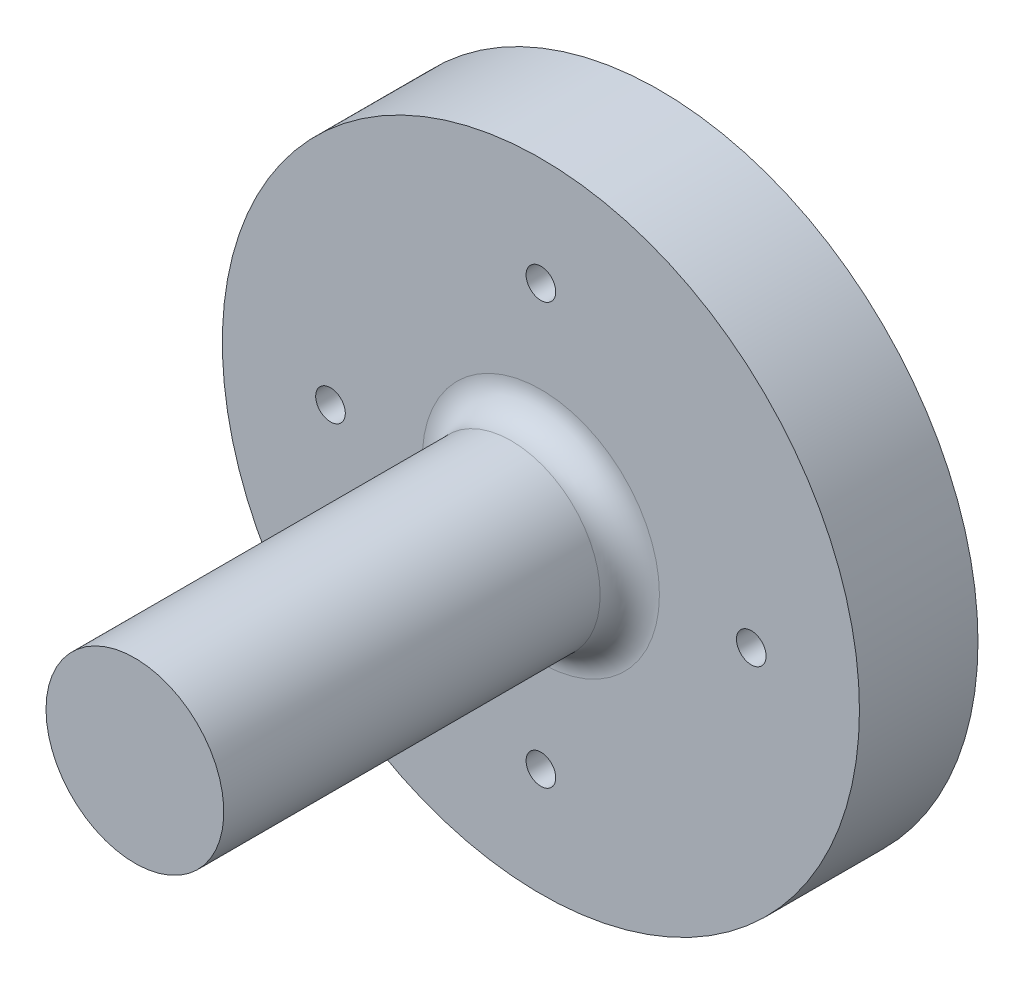
ISO-10303-21;
HEADER;
FILE_DESCRIPTION(('STEP AP214'),'2;1');
FILE_NAME('part.step','',(''),(''),'','','');
FILE_SCHEMA(('AUTOMOTIVE_DESIGN { 1 0 10303 214 1 1 1 1 }'));
ENDSEC;
DATA;
#1=APPLICATION_CONTEXT('core data for automotive mechanical design processes');
#2=APPLICATION_PROTOCOL_DEFINITION('international standard','automotive_design',2000,#1);
#3=PRODUCT_CONTEXT('',#1,'mechanical');
#4=PRODUCT('Part','Part','',(#3));
#5=PRODUCT_RELATED_PRODUCT_CATEGORY('part','',(#4));
#6=PRODUCT_DEFINITION_FORMATION('','',#4);
#7=PRODUCT_DEFINITION_CONTEXT('part definition',#1,'design');
#8=PRODUCT_DEFINITION('design','',#6,#7);
#9=PRODUCT_DEFINITION_SHAPE('','',#8);
#10=(LENGTH_UNIT() NAMED_UNIT(*) SI_UNIT(.MILLI.,.METRE.));
#11=(NAMED_UNIT(*) PLANE_ANGLE_UNIT() SI_UNIT($,.RADIAN.));
#12=(NAMED_UNIT(*) SI_UNIT($,.STERADIAN.) SOLID_ANGLE_UNIT());
#13=UNCERTAINTY_MEASURE_WITH_UNIT(LENGTH_MEASURE(1.E-05),#10,'distance_accuracy_value','');
#14=(GEOMETRIC_REPRESENTATION_CONTEXT(3) GLOBAL_UNCERTAINTY_ASSIGNED_CONTEXT((#13)) GLOBAL_UNIT_ASSIGNED_CONTEXT((#10,
#11,#12)) REPRESENTATION_CONTEXT('',''));
#15=CARTESIAN_POINT('',(0.,0.,0.));
#16=DIRECTION('',(0.,0.,1.));
#17=DIRECTION('',(1.,0.,0.));
#18=AXIS2_PLACEMENT_3D('',#15,#16,#17);
#19=CARTESIAN_POINT('',(0.,0.,4.));
#20=DIRECTION('',(0.,0.,-1.));
#21=DIRECTION('',(-1.,0.,0.));
#22=AXIS2_PLACEMENT_3D('',#19,#20,#21);
#23=CYLINDRICAL_SURFACE('',#22,10.75);
#24=CARTESIAN_POINT('',(0.,0.,4.));
#25=DIRECTION('',(0.,0.,1.));
#26=DIRECTION('',(1.,0.,0.));
#27=AXIS2_PLACEMENT_3D('',#24,#25,#26);
#28=CIRCLE('',#27,10.75);
#29=CARTESIAN_POINT('',(10.75,0.,4.));
#30=VERTEX_POINT('',#29);
#31=EDGE_CURVE('E41',#30,#30,#28,.T.);
#32=ORIENTED_EDGE('',*,*,#31,.F.);
#33=EDGE_LOOP('',(#32));
#34=FACE_BOUND('',#33,.T.);
#35=CARTESIAN_POINT('',(0.,0.,0.));
#36=DIRECTION('',(0.,0.,1.));
#37=DIRECTION('',(1.,0.,0.));
#38=AXIS2_PLACEMENT_3D('',#35,#36,#37);
#39=CIRCLE('',#38,10.75);
#40=CARTESIAN_POINT('',(10.75,0.,0.));
#41=VERTEX_POINT('',#40);
#42=EDGE_CURVE('E45',#41,#41,#39,.T.);
#43=ORIENTED_EDGE('',*,*,#42,.T.);
#44=EDGE_LOOP('',(#43));
#45=FACE_BOUND('',#44,.T.);
#46=ADVANCED_FACE('F30',(#34,#45),#23,.T.);
#47=CARTESIAN_POINT('',(0.,0.,4.));
#48=DIRECTION('',(0.,0.,1.));
#49=DIRECTION('',(1.,0.,0.));
#50=AXIS2_PLACEMENT_3D('',#47,#48,#49);
#51=PLANE('',#50);
#52=CARTESIAN_POINT('',(7.1,0.,4.));
#53=DIRECTION('',(0.,0.,1.));
#54=DIRECTION('',(1.,0.,0.));
#55=AXIS2_PLACEMENT_3D('',#52,#53,#54);
#56=CIRCLE('',#55,0.500000000000001);
#57=CARTESIAN_POINT('',(7.6,0.,4.));
#58=VERTEX_POINT('',#57);
#59=EDGE_CURVE('E72',#58,#58,#56,.T.);
#60=ORIENTED_EDGE('',*,*,#59,.F.);
#61=EDGE_LOOP('',(#60));
#62=FACE_BOUND('',#61,.T.);
#63=CARTESIAN_POINT('',(-7.1,0.,4.));
#64=DIRECTION('',(0.,0.,1.));
#65=DIRECTION('',(1.,0.,0.));
#66=AXIS2_PLACEMENT_3D('',#63,#64,#65);
#67=CIRCLE('',#66,0.500000000000001);
#68=CARTESIAN_POINT('',(-6.6,0.,4.));
#69=VERTEX_POINT('',#68);
#70=EDGE_CURVE('E66',#69,#69,#67,.T.);
#71=ORIENTED_EDGE('',*,*,#70,.F.);
#72=EDGE_LOOP('',(#71));
#73=FACE_BOUND('',#72,.T.);
#74=CARTESIAN_POINT('',(0.,7.1,4.));
#75=DIRECTION('',(0.,0.,1.));
#76=DIRECTION('',(1.,0.,0.));
#77=AXIS2_PLACEMENT_3D('',#74,#75,#76);
#78=CIRCLE('',#77,0.5);
#79=CARTESIAN_POINT('',(0.5,7.1,4.));
#80=VERTEX_POINT('',#79);
#81=EDGE_CURVE('E60',#80,#80,#78,.T.);
#82=ORIENTED_EDGE('',*,*,#81,.F.);
#83=EDGE_LOOP('',(#82));
#84=FACE_BOUND('',#83,.T.);
#85=CARTESIAN_POINT('',(0.,-7.1,4.));
#86=DIRECTION('',(0.,0.,1.));
#87=DIRECTION('',(1.,0.,0.));
#88=AXIS2_PLACEMENT_3D('',#85,#86,#87);
#89=CIRCLE('',#88,0.5);
#90=CARTESIAN_POINT('',(0.5,-7.1,4.));
#91=VERTEX_POINT('',#90);
#92=EDGE_CURVE('E54',#91,#91,#89,.T.);
#93=ORIENTED_EDGE('',*,*,#92,.F.);
#94=EDGE_LOOP('',(#93));
#95=FACE_BOUND('',#94,.T.);
#96=CARTESIAN_POINT('',(0.,0.,4.));
#97=DIRECTION('',(0.,0.,1.));
#98=DIRECTION('',(1.,0.,0.));
#99=AXIS2_PLACEMENT_3D('',#96,#97,#98);
#100=CIRCLE('',#99,4.);
#101=CARTESIAN_POINT('',(4.,0.,4.));
#102=VERTEX_POINT('',#101);
#103=EDGE_CURVE('E10',#102,#102,#100,.F.);
#104=ORIENTED_EDGE('',*,*,#103,.T.);
#105=EDGE_LOOP('',(#104));
#106=FACE_BOUND('',#105,.T.);
#107=ORIENTED_EDGE('',*,*,#31,.T.);
#108=EDGE_LOOP('',(#107));
#109=FACE_BOUND('',#108,.T.);
#110=ADVANCED_FACE('F88',(#62,#73,#84,#95,#106,#109),#51,.T.);
#111=CARTESIAN_POINT('',(0.,0.,0.));
#112=DIRECTION('',(0.,0.,1.));
#113=DIRECTION('',(1.,0.,0.));
#114=AXIS2_PLACEMENT_3D('',#111,#112,#113);
#115=PLANE('',#114);
#116=CARTESIAN_POINT('',(7.1,0.,0.));
#117=DIRECTION('',(0.,0.,1.));
#118=DIRECTION('',(1.,0.,0.));
#119=AXIS2_PLACEMENT_3D('',#116,#117,#118);
#120=CIRCLE('',#119,0.500000000000001);
#121=CARTESIAN_POINT('',(7.6,0.,0.));
#122=VERTEX_POINT('',#121);
#123=EDGE_CURVE('E53',#122,#122,#120,.T.);
#124=ORIENTED_EDGE('',*,*,#123,.T.);
#125=EDGE_LOOP('',(#124));
#126=FACE_BOUND('',#125,.T.);
#127=CARTESIAN_POINT('',(-7.1,0.,0.));
#128=DIRECTION('',(0.,0.,1.));
#129=DIRECTION('',(1.,0.,0.));
#130=AXIS2_PLACEMENT_3D('',#127,#128,#129);
#131=CIRCLE('',#130,0.500000000000001);
#132=CARTESIAN_POINT('',(-6.6,0.,0.));
#133=VERTEX_POINT('',#132);
#134=EDGE_CURVE('E69',#133,#133,#131,.T.);
#135=ORIENTED_EDGE('',*,*,#134,.T.);
#136=EDGE_LOOP('',(#135));
#137=FACE_BOUND('',#136,.T.);
#138=CARTESIAN_POINT('',(0.,7.1,0.));
#139=DIRECTION('',(0.,0.,1.));
#140=DIRECTION('',(1.,0.,0.));
#141=AXIS2_PLACEMENT_3D('',#138,#139,#140);
#142=CIRCLE('',#141,0.5);
#143=CARTESIAN_POINT('',(0.5,7.1,0.));
#144=VERTEX_POINT('',#143);
#145=EDGE_CURVE('E63',#144,#144,#142,.T.);
#146=ORIENTED_EDGE('',*,*,#145,.T.);
#147=EDGE_LOOP('',(#146));
#148=FACE_BOUND('',#147,.T.);
#149=CARTESIAN_POINT('',(0.,-7.1,0.));
#150=DIRECTION('',(0.,0.,1.));
#151=DIRECTION('',(1.,0.,0.));
#152=AXIS2_PLACEMENT_3D('',#149,#150,#151);
#153=CIRCLE('',#152,0.5);
#154=CARTESIAN_POINT('',(0.5,-7.1,0.));
#155=VERTEX_POINT('',#154);
#156=EDGE_CURVE('E57',#155,#155,#153,.T.);
#157=ORIENTED_EDGE('',*,*,#156,.T.);
#158=EDGE_LOOP('',(#157));
#159=FACE_BOUND('',#158,.T.);
#160=ORIENTED_EDGE('',*,*,#42,.F.);
#161=EDGE_LOOP('',(#160));
#162=FACE_BOUND('',#161,.T.);
#163=ADVANCED_FACE('F78',(#126,#137,#148,#159,#162),#115,.F.);
#164=CARTESIAN_POINT('',(0.,0.,17.7));
#165=DIRECTION('',(0.,0.,-1.));
#166=DIRECTION('',(-1.,0.,0.));
#167=AXIS2_PLACEMENT_3D('',#164,#165,#166);
#168=CYLINDRICAL_SURFACE('',#167,3.);
#169=CARTESIAN_POINT('',(0.,0.,5.));
#170=DIRECTION('',(0.,0.,1.));
#171=DIRECTION('',(1.,0.,0.));
#172=AXIS2_PLACEMENT_3D('',#169,#170,#171);
#173=CIRCLE('',#172,3.);
#174=CARTESIAN_POINT('',(-3.,0.,5.));
#175=VERTEX_POINT('',#174);
#176=EDGE_CURVE('E37',#175,#175,#173,.T.);
#177=CARTESIAN_POINT('',(0.,0.,17.7));
#178=DIRECTION('',(0.,0.,1.));
#179=DIRECTION('',(1.,0.,0.));
#180=AXIS2_PLACEMENT_3D('',#177,#178,#179);
#181=CIRCLE('',#180,3.);
#182=CARTESIAN_POINT('',(-3.,0.,17.7));
#183=VERTEX_POINT('',#182);
#184=EDGE_CURVE('E49',#183,#183,#181,.T.);
#185=CARTESIAN_POINT('',(-3.,0.,5.));
#186=CARTESIAN_POINT('',(-3.,0.,5.13229166666667));
#187=CARTESIAN_POINT('',(-3.,0.,5.26458333333333));
#188=CARTESIAN_POINT('',(-3.,0.,5.52916666666667));
#189=CARTESIAN_POINT('',(-3.,0.,5.66145833333333));
#190=CARTESIAN_POINT('',(-3.,0.,5.92604166666667));
#191=CARTESIAN_POINT('',(-3.,0.,6.05833333333333));
#192=CARTESIAN_POINT('',(-3.,0.,6.32291666666667));
#193=CARTESIAN_POINT('',(-3.,0.,6.45520833333333));
#194=CARTESIAN_POINT('',(-3.,0.,6.71979166666667));
#195=CARTESIAN_POINT('',(-3.,0.,6.85208333333333));
#196=CARTESIAN_POINT('',(-3.,0.,7.11666666666667));
#197=CARTESIAN_POINT('',(-3.,0.,7.24895833333333));
#198=CARTESIAN_POINT('',(-3.,0.,7.51354166666667));
#199=CARTESIAN_POINT('',(-3.,0.,7.64583333333333));
#200=CARTESIAN_POINT('',(-3.,0.,7.91041666666667));
#201=CARTESIAN_POINT('',(-3.,0.,8.04270833333333));
#202=CARTESIAN_POINT('',(-3.,0.,8.30729166666667));
#203=CARTESIAN_POINT('',(-3.,0.,8.43958333333333));
#204=CARTESIAN_POINT('',(-3.,0.,8.70416666666667));
#205=CARTESIAN_POINT('',(-3.,0.,8.83645833333333));
#206=CARTESIAN_POINT('',(-3.,0.,9.10104166666667));
#207=CARTESIAN_POINT('',(-3.,0.,9.23333333333333));
#208=CARTESIAN_POINT('',(-3.,0.,9.49791666666667));
#209=CARTESIAN_POINT('',(-3.,0.,9.63020833333333));
#210=CARTESIAN_POINT('',(-3.,0.,9.89479166666666));
#211=CARTESIAN_POINT('',(-3.,0.,10.0270833333333));
#212=CARTESIAN_POINT('',(-3.,0.,10.2916666666667));
#213=CARTESIAN_POINT('',(-3.,0.,10.4239583333333));
#214=CARTESIAN_POINT('',(-3.,0.,10.6885416666667));
#215=CARTESIAN_POINT('',(-3.,0.,10.8208333333333));
#216=CARTESIAN_POINT('',(-3.,0.,11.0854166666667));
#217=CARTESIAN_POINT('',(-3.,0.,11.2177083333333));
#218=CARTESIAN_POINT('',(-3.,0.,11.4822916666667));
#219=CARTESIAN_POINT('',(-3.,0.,11.6145833333333));
#220=CARTESIAN_POINT('',(-3.,0.,11.8791666666667));
#221=CARTESIAN_POINT('',(-3.,0.,12.0114583333333));
#222=CARTESIAN_POINT('',(-3.,0.,12.2760416666667));
#223=CARTESIAN_POINT('',(-3.,0.,12.4083333333333));
#224=CARTESIAN_POINT('',(-3.,0.,12.6729166666667));
#225=CARTESIAN_POINT('',(-3.,0.,12.8052083333333));
#226=CARTESIAN_POINT('',(-3.,0.,13.0697916666667));
#227=CARTESIAN_POINT('',(-3.,0.,13.2020833333333));
#228=CARTESIAN_POINT('',(-3.,0.,13.4666666666667));
#229=CARTESIAN_POINT('',(-3.,0.,13.5989583333333));
#230=CARTESIAN_POINT('',(-3.,0.,13.8635416666667));
#231=CARTESIAN_POINT('',(-3.,0.,13.9958333333333));
#232=CARTESIAN_POINT('',(-3.,0.,14.2604166666667));
#233=CARTESIAN_POINT('',(-3.,0.,14.3927083333333));
#234=CARTESIAN_POINT('',(-3.,0.,14.6572916666667));
#235=CARTESIAN_POINT('',(-3.,0.,14.7895833333333));
#236=CARTESIAN_POINT('',(-3.,0.,15.0541666666667));
#237=CARTESIAN_POINT('',(-3.,0.,15.1864583333333));
#238=CARTESIAN_POINT('',(-3.,0.,15.4510416666667));
#239=CARTESIAN_POINT('',(-3.,0.,15.5833333333333));
#240=CARTESIAN_POINT('',(-3.,0.,15.8479166666667));
#241=CARTESIAN_POINT('',(-3.,0.,15.9802083333333));
#242=CARTESIAN_POINT('',(-3.,0.,16.2447916666667));
#243=CARTESIAN_POINT('',(-3.,0.,16.3770833333333));
#244=CARTESIAN_POINT('',(-3.,0.,16.6416666666667));
#245=CARTESIAN_POINT('',(-3.,0.,16.7739583333333));
#246=CARTESIAN_POINT('',(-3.,0.,17.0385416666667));
#247=CARTESIAN_POINT('',(-3.,0.,17.1708333333333));
#248=CARTESIAN_POINT('',(-3.,0.,17.4354166666667));
#249=CARTESIAN_POINT('',(-3.,0.,17.5677083333333));
#250=CARTESIAN_POINT('',(-3.,0.,17.7));
#251=B_SPLINE_CURVE_WITH_KNOTS('',3,(#185,#186,#187,#188,#189,#190,#191,#192,#193,#194,#195,
#196,#197,#198,#199,#200,#201,#202,#203,#204,#205,#206,#207,#208,#209,#210,#211,#212,#213,#214,
#215,#216,#217,#218,#219,#220,#221,#222,#223,#224,#225,#226,#227,#228,#229,#230,#231,#232,#233,
#234,#235,#236,#237,#238,#239,#240,#241,#242,#243,#244,#245,#246,#247,#248,#249,#250),
.UNSPECIFIED.,.F.,.F.,(4,2,2,2,2,2,2,2,2,2,2,2,2,2,2,2,2,2,2,2,2,2,2,2,2,2,2,2,2,2,2,2,4),(0.,
0.396875,0.793749999999999,1.190625,1.5875,1.984375,2.38125,2.778125,3.175,3.571875,3.96875,
4.365625,4.7625,5.159375,5.55625,5.953125,6.35,6.746875,7.14375,7.540625,7.9375,8.334375,
8.73125,9.128125,9.525,9.921875,10.31875,10.715625,11.1125,11.509375,11.90625,12.303125,12.7),.UNSPECIFIED.);
#252=EDGE_CURVE('BSEAM105',#175,#183,#251,.T.);
#253=ORIENTED_EDGE('',*,*,#176,.T.);
#254=ORIENTED_EDGE('',*,*,#184,.F.);
#255=ORIENTED_EDGE('',*,*,#252,.T.);
#256=ORIENTED_EDGE('',*,*,#252,.F.);
#257=EDGE_LOOP('',(#253,#255,#254,#256));
#258=FACE_BOUND('',#257,.T.);
#259=ADVANCED_FACE('F105',(#258),#168,.T.);
#260=CARTESIAN_POINT('',(0.,0.,17.7));
#261=DIRECTION('',(0.,0.,1.));
#262=DIRECTION('',(1.,0.,0.));
#263=AXIS2_PLACEMENT_3D('',#260,#261,#262);
#264=PLANE('',#263);
#265=ORIENTED_EDGE('',*,*,#184,.T.);
#266=EDGE_LOOP('',(#265));
#267=FACE_BOUND('',#266,.T.);
#268=ADVANCED_FACE('F110',(#267),#264,.T.);
#269=CARTESIAN_POINT('',(0.,0.,5.));
#270=DIRECTION('',(0.,0.,1.));
#271=DIRECTION('',(1.,0.,0.));
#272=AXIS2_PLACEMENT_3D('',#269,#270,#271);
#273=TOROIDAL_SURFACE('',#272,4.,1.);
#274=ORIENTED_EDGE('',*,*,#103,.F.);
#275=EDGE_LOOP('',(#274));
#276=FACE_BOUND('',#275,.T.);
#277=ORIENTED_EDGE('',*,*,#176,.F.);
#278=EDGE_LOOP('',(#277));
#279=FACE_BOUND('',#278,.T.);
#280=ADVANCED_FACE('F32',(#276,#279),#273,.F.);
#281=CARTESIAN_POINT('',(0.,-7.1,0.));
#282=DIRECTION('',(0.,0.,1.));
#283=DIRECTION('',(1.,0.,0.));
#284=AXIS2_PLACEMENT_3D('',#281,#282,#283);
#285=CYLINDRICAL_SURFACE('',#284,0.5);
#286=ORIENTED_EDGE('',*,*,#156,.F.);
#287=EDGE_LOOP('',(#286));
#288=FACE_BOUND('',#287,.T.);
#289=ORIENTED_EDGE('',*,*,#92,.T.);
#290=EDGE_LOOP('',(#289));
#291=FACE_BOUND('',#290,.T.);
#292=ADVANCED_FACE('F116',(#288,#291),#285,.F.);
#293=CARTESIAN_POINT('',(0.,7.1,0.));
#294=DIRECTION('',(0.,0.,1.));
#295=DIRECTION('',(1.,0.,0.));
#296=AXIS2_PLACEMENT_3D('',#293,#294,#295);
#297=CYLINDRICAL_SURFACE('',#296,0.5);
#298=ORIENTED_EDGE('',*,*,#145,.F.);
#299=EDGE_LOOP('',(#298));
#300=FACE_BOUND('',#299,.T.);
#301=ORIENTED_EDGE('',*,*,#81,.T.);
#302=EDGE_LOOP('',(#301));
#303=FACE_BOUND('',#302,.T.);
#304=ADVANCED_FACE('F119',(#300,#303),#297,.F.);
#305=CARTESIAN_POINT('',(-7.1,0.,0.));
#306=DIRECTION('',(0.,0.,1.));
#307=DIRECTION('',(1.,0.,0.));
#308=AXIS2_PLACEMENT_3D('',#305,#306,#307);
#309=CYLINDRICAL_SURFACE('',#308,0.500000000000001);
#310=ORIENTED_EDGE('',*,*,#134,.F.);
#311=EDGE_LOOP('',(#310));
#312=FACE_BOUND('',#311,.T.);
#313=ORIENTED_EDGE('',*,*,#70,.T.);
#314=EDGE_LOOP('',(#313));
#315=FACE_BOUND('',#314,.T.);
#316=ADVANCED_FACE('F84',(#312,#315),#309,.F.);
#317=CARTESIAN_POINT('',(7.1,0.,0.));
#318=DIRECTION('',(0.,0.,1.));
#319=DIRECTION('',(1.,0.,0.));
#320=AXIS2_PLACEMENT_3D('',#317,#318,#319);
#321=CYLINDRICAL_SURFACE('',#320,0.500000000000001);
#322=ORIENTED_EDGE('',*,*,#123,.F.);
#323=EDGE_LOOP('',(#322));
#324=FACE_BOUND('',#323,.T.);
#325=ORIENTED_EDGE('',*,*,#59,.T.);
#326=EDGE_LOOP('',(#325));
#327=FACE_BOUND('',#326,.T.);
#328=ADVANCED_FACE('F81',(#324,#327),#321,.F.);
#329=CLOSED_SHELL('',(#46,#110,#163,#259,#268,#280,#292,#304,#316,#328));
#330=MANIFOLD_SOLID_BREP('B2',#329);
#331=ADVANCED_BREP_SHAPE_REPRESENTATION('',(#18,#330),#14);
#332=SHAPE_DEFINITION_REPRESENTATION(#9,#331);
ENDSEC;
END-ISO-10303-21;
